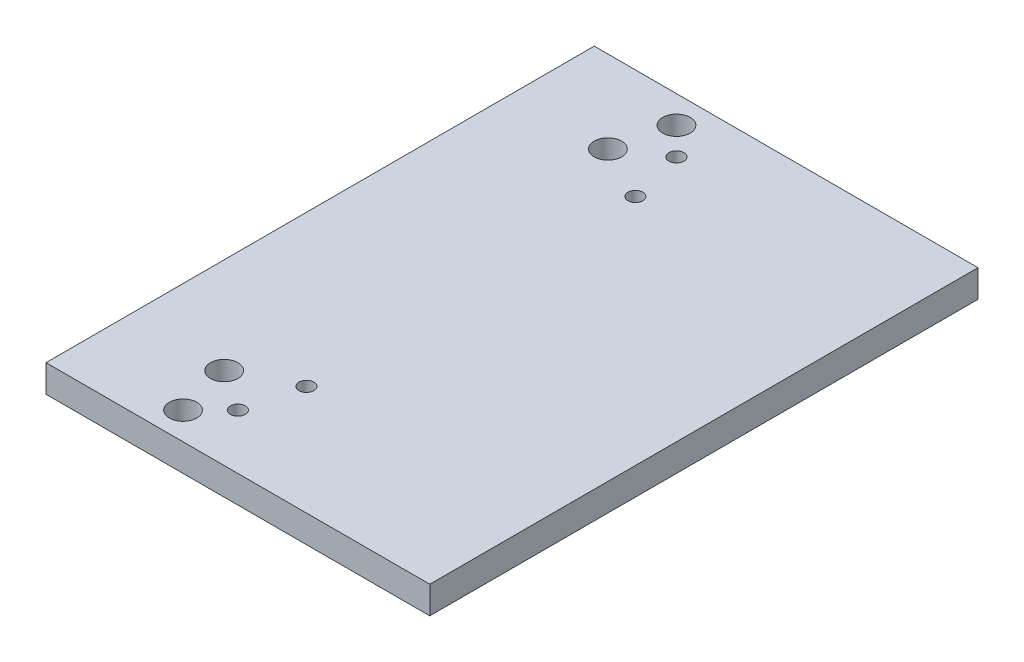
ISO-10303-21;
HEADER;
FILE_DESCRIPTION(('STEP AP214'),'2;1');
FILE_NAME('part.step','',(''),(''),'','','');
FILE_SCHEMA(('AUTOMOTIVE_DESIGN { 1 0 10303 214 1 1 1 1 }'));
ENDSEC;
DATA;
#1=APPLICATION_CONTEXT('core data for automotive mechanical design processes');
#2=APPLICATION_PROTOCOL_DEFINITION('international standard','automotive_design',2000,#1);
#3=PRODUCT_CONTEXT('',#1,'mechanical');
#4=PRODUCT('Part','Part','',(#3));
#5=PRODUCT_RELATED_PRODUCT_CATEGORY('part','',(#4));
#6=PRODUCT_DEFINITION_FORMATION('','',#4);
#7=PRODUCT_DEFINITION_CONTEXT('part definition',#1,'design');
#8=PRODUCT_DEFINITION('design','',#6,#7);
#9=PRODUCT_DEFINITION_SHAPE('','',#8);
#10=(LENGTH_UNIT() NAMED_UNIT(*) SI_UNIT(.MILLI.,.METRE.));
#11=(NAMED_UNIT(*) PLANE_ANGLE_UNIT() SI_UNIT($,.RADIAN.));
#12=(NAMED_UNIT(*) SI_UNIT($,.STERADIAN.) SOLID_ANGLE_UNIT());
#13=UNCERTAINTY_MEASURE_WITH_UNIT(LENGTH_MEASURE(1.E-05),#10,'distance_accuracy_value','');
#14=(GEOMETRIC_REPRESENTATION_CONTEXT(3) GLOBAL_UNCERTAINTY_ASSIGNED_CONTEXT((#13)) GLOBAL_UNIT_ASSIGNED_CONTEXT((#10,
#11,#12)) REPRESENTATION_CONTEXT('',''));
#15=CARTESIAN_POINT('',(0.,0.,0.));
#16=DIRECTION('',(0.,0.,1.));
#17=DIRECTION('',(1.,0.,0.));
#18=AXIS2_PLACEMENT_3D('',#15,#16,#17);
#19=CARTESIAN_POINT('',(0.,6.35,0.));
#20=DIRECTION('',(0.,-1.,0.));
#21=DIRECTION('',(0.,0.,-1.));
#22=AXIS2_PLACEMENT_3D('',#19,#20,#21);
#23=PLANE('',#22);
#24=CARTESIAN_POINT('',(-12.7,6.35,-50.8));
#25=DIRECTION('',(0.,1.,0.));
#26=DIRECTION('',(0.,0.,1.));
#27=AXIS2_PLACEMENT_3D('',#24,#25,#26);
#28=CIRCLE('',#27,1.7272);
#29=CARTESIAN_POINT('',(-12.7,6.35,-49.0728));
#30=VERTEX_POINT('',#29);
#31=EDGE_CURVE('E287',#30,#30,#28,.T.);
#32=ORIENTED_EDGE('',*,*,#31,.F.);
#33=EDGE_LOOP('',(#32));
#34=FACE_BOUND('',#33,.T.);
#35=CARTESIAN_POINT('',(-12.7,6.35,50.8));
#36=DIRECTION('',(0.,1.,0.));
#37=DIRECTION('',(0.,0.,1.));
#38=AXIS2_PLACEMENT_3D('',#35,#36,#37);
#39=CIRCLE('',#38,1.7272);
#40=CARTESIAN_POINT('',(-12.7,6.35,52.5272));
#41=VERTEX_POINT('',#40);
#42=EDGE_CURVE('E291',#41,#41,#39,.T.);
#43=ORIENTED_EDGE('',*,*,#42,.F.);
#44=EDGE_LOOP('',(#43));
#45=FACE_BOUND('',#44,.T.);
#46=CARTESIAN_POINT('',(-19.05,6.35,-57.15));
#47=DIRECTION('',(0.,1.,0.));
#48=DIRECTION('',(0.,0.,1.));
#49=AXIS2_PLACEMENT_3D('',#46,#47,#48);
#50=CIRCLE('',#49,3.175);
#51=CARTESIAN_POINT('',(-19.05,6.35,-53.975));
#52=VERTEX_POINT('',#51);
#53=EDGE_CURVE('E301',#52,#52,#50,.T.);
#54=ORIENTED_EDGE('',*,*,#53,.F.);
#55=EDGE_LOOP('',(#54));
#56=FACE_BOUND('',#55,.T.);
#57=CARTESIAN_POINT('',(-19.05,6.35,57.15));
#58=DIRECTION('',(0.,1.,0.));
#59=DIRECTION('',(0.,0.,1.));
#60=AXIS2_PLACEMENT_3D('',#57,#58,#59);
#61=CIRCLE('',#60,3.175);
#62=CARTESIAN_POINT('',(-19.05,6.35,60.325));
#63=VERTEX_POINT('',#62);
#64=EDGE_CURVE('E309',#63,#63,#61,.T.);
#65=ORIENTED_EDGE('',*,*,#64,.F.);
#66=EDGE_LOOP('',(#65));
#67=FACE_BOUND('',#66,.T.);
#68=CARTESIAN_POINT('',(-22.225,6.35,-44.45));
#69=DIRECTION('',(0.,1.,0.));
#70=DIRECTION('',(0.,0.,1.));
#71=AXIS2_PLACEMENT_3D('',#68,#69,#70);
#72=CIRCLE('',#71,3.175);
#73=CARTESIAN_POINT('',(-22.225,6.35,-41.275));
#74=VERTEX_POINT('',#73);
#75=EDGE_CURVE('E341',#74,#74,#72,.T.);
#76=ORIENTED_EDGE('',*,*,#75,.F.);
#77=EDGE_LOOP('',(#76));
#78=FACE_BOUND('',#77,.T.);
#79=DIRECTION('',(0.,0.,-1.));
#80=VECTOR('',#79,1.);
#81=CARTESIAN_POINT('',(-44.45,6.35,63.5));
#82=LINE('',#81,#80);
#83=CARTESIAN_POINT('',(-44.45,6.35,63.5));
#84=VERTEX_POINT('',#83);
#85=CARTESIAN_POINT('',(-44.45,6.35,-63.5));
#86=VERTEX_POINT('',#85);
#87=EDGE_CURVE('E107',#84,#86,#82,.T.);
#88=ORIENTED_EDGE('',*,*,#87,.F.);
#89=DIRECTION('',(1.,0.,0.));
#90=VECTOR('',#89,1.);
#91=CARTESIAN_POINT('',(-44.45,6.35,63.5));
#92=LINE('',#91,#90);
#93=CARTESIAN_POINT('',(44.45,6.35,63.5));
#94=VERTEX_POINT('',#93);
#95=EDGE_CURVE('E94',#84,#94,#92,.T.);
#96=ORIENTED_EDGE('',*,*,#95,.T.);
#97=DIRECTION('',(0.,0.,-1.));
#98=VECTOR('',#97,1.);
#99=CARTESIAN_POINT('',(44.45,6.35,63.5));
#100=LINE('',#99,#98);
#101=CARTESIAN_POINT('',(44.45,6.35,-63.5));
#102=VERTEX_POINT('',#101);
#103=EDGE_CURVE('E89',#94,#102,#100,.T.);
#104=ORIENTED_EDGE('',*,*,#103,.T.);
#105=DIRECTION('',(1.,0.,0.));
#106=VECTOR('',#105,1.);
#107=CARTESIAN_POINT('',(-44.45,6.35,-63.5));
#108=LINE('',#107,#106);
#109=EDGE_CURVE('E93',#86,#102,#108,.T.);
#110=ORIENTED_EDGE('',*,*,#109,.F.);
#111=EDGE_LOOP('',(#88,#96,#104,#110));
#112=FACE_BOUND('',#111,.T.);
#113=CARTESIAN_POINT('',(-22.225,6.35,44.45));
#114=DIRECTION('',(0.,1.,0.));
#115=DIRECTION('',(0.,0.,1.));
#116=AXIS2_PLACEMENT_3D('',#113,#114,#115);
#117=CIRCLE('',#116,3.175);
#118=CARTESIAN_POINT('',(-22.225,6.35,47.625));
#119=VERTEX_POINT('',#118);
#120=EDGE_CURVE('E333',#119,#119,#117,.T.);
#121=ORIENTED_EDGE('',*,*,#120,.F.);
#122=EDGE_LOOP('',(#121));
#123=FACE_BOUND('',#122,.T.);
#124=CARTESIAN_POINT('',(-9.525,6.35,-38.1));
#125=DIRECTION('',(0.,1.,0.));
#126=DIRECTION('',(0.,0.,1.));
#127=AXIS2_PLACEMENT_3D('',#124,#125,#126);
#128=CIRCLE('',#127,1.7272);
#129=CARTESIAN_POINT('',(-9.525,6.35,-36.3728));
#130=VERTEX_POINT('',#129);
#131=EDGE_CURVE('E325',#130,#130,#128,.T.);
#132=ORIENTED_EDGE('',*,*,#131,.F.);
#133=EDGE_LOOP('',(#132));
#134=FACE_BOUND('',#133,.T.);
#135=CARTESIAN_POINT('',(-9.52500000000001,6.35,38.1));
#136=DIRECTION('',(0.,1.,0.));
#137=DIRECTION('',(0.,0.,1.));
#138=AXIS2_PLACEMENT_3D('',#135,#136,#137);
#139=CIRCLE('',#138,1.7272);
#140=CARTESIAN_POINT('',(-9.52500000000001,6.35,39.8272));
#141=VERTEX_POINT('',#140);
#142=EDGE_CURVE('E317',#141,#141,#139,.T.);
#143=ORIENTED_EDGE('',*,*,#142,.F.);
#144=EDGE_LOOP('',(#143));
#145=FACE_BOUND('',#144,.T.);
#146=ADVANCED_FACE('F42',(#34,#45,#56,#67,#78,#112,#123,#134,#145),#23,.F.);
#147=CARTESIAN_POINT('',(-44.45,6.35,63.5));
#148=DIRECTION('',(-1.,0.,0.));
#149=DIRECTION('',(0.,0.,1.));
#150=AXIS2_PLACEMENT_3D('',#147,#148,#149);
#151=PLANE('',#150);
#152=DIRECTION('',(0.,0.,-1.));
#153=VECTOR('',#152,1.);
#154=CARTESIAN_POINT('',(-44.45,0.,63.5));
#155=LINE('',#154,#153);
#156=CARTESIAN_POINT('',(-44.45,0.,63.5));
#157=VERTEX_POINT('',#156);
#158=CARTESIAN_POINT('',(-44.45,0.,-63.5));
#159=VERTEX_POINT('',#158);
#160=EDGE_CURVE('E115',#157,#159,#155,.T.);
#161=ORIENTED_EDGE('',*,*,#160,.F.);
#162=DIRECTION('',(0.,-1.,0.));
#163=VECTOR('',#162,1.);
#164=CARTESIAN_POINT('',(-44.45,6.35,63.5));
#165=LINE('',#164,#163);
#166=EDGE_CURVE('E11',#84,#157,#165,.T.);
#167=ORIENTED_EDGE('',*,*,#166,.F.);
#168=ORIENTED_EDGE('',*,*,#87,.T.);
#169=DIRECTION('',(0.,-1.,0.));
#170=VECTOR('',#169,1.);
#171=CARTESIAN_POINT('',(-44.45,6.35,-63.5));
#172=LINE('',#171,#170);
#173=EDGE_CURVE('E46',#86,#159,#172,.T.);
#174=ORIENTED_EDGE('',*,*,#173,.T.);
#175=EDGE_LOOP('',(#161,#167,#168,#174));
#176=FACE_BOUND('',#175,.T.);
#177=ADVANCED_FACE('F44',(#176),#151,.T.);
#178=CARTESIAN_POINT('',(-44.45,6.35,63.5));
#179=DIRECTION('',(0.,0.,-1.));
#180=DIRECTION('',(-1.,0.,0.));
#181=AXIS2_PLACEMENT_3D('',#178,#179,#180);
#182=PLANE('',#181);
#183=DIRECTION('',(1.,0.,0.));
#184=VECTOR('',#183,1.);
#185=CARTESIAN_POINT('',(-44.45,0.,63.5));
#186=LINE('',#185,#184);
#187=CARTESIAN_POINT('',(44.45,0.,63.5));
#188=VERTEX_POINT('',#187);
#189=EDGE_CURVE('E77',#157,#188,#186,.T.);
#190=ORIENTED_EDGE('',*,*,#189,.T.);
#191=DIRECTION('',(0.,-1.,0.));
#192=VECTOR('',#191,1.);
#193=CARTESIAN_POINT('',(44.45,6.35,63.5));
#194=LINE('',#193,#192);
#195=EDGE_CURVE('E53',#94,#188,#194,.T.);
#196=ORIENTED_EDGE('',*,*,#195,.F.);
#197=ORIENTED_EDGE('',*,*,#95,.F.);
#198=ORIENTED_EDGE('',*,*,#166,.T.);
#199=EDGE_LOOP('',(#190,#196,#197,#198));
#200=FACE_BOUND('',#199,.T.);
#201=ADVANCED_FACE('F132',(#200),#182,.F.);
#202=CARTESIAN_POINT('',(44.45,6.35,63.5));
#203=DIRECTION('',(-1.,0.,0.));
#204=DIRECTION('',(0.,0.,1.));
#205=AXIS2_PLACEMENT_3D('',#202,#203,#204);
#206=PLANE('',#205);
#207=DIRECTION('',(0.,0.,-1.));
#208=VECTOR('',#207,1.);
#209=CARTESIAN_POINT('',(44.45,0.,63.5));
#210=LINE('',#209,#208);
#211=CARTESIAN_POINT('',(44.45,0.,-63.5));
#212=VERTEX_POINT('',#211);
#213=EDGE_CURVE('E102',#188,#212,#210,.T.);
#214=ORIENTED_EDGE('',*,*,#213,.T.);
#215=DIRECTION('',(0.,-1.,0.));
#216=VECTOR('',#215,1.);
#217=CARTESIAN_POINT('',(44.45,6.35,-63.5));
#218=LINE('',#217,#216);
#219=EDGE_CURVE('E99',#102,#212,#218,.T.);
#220=ORIENTED_EDGE('',*,*,#219,.F.);
#221=ORIENTED_EDGE('',*,*,#103,.F.);
#222=ORIENTED_EDGE('',*,*,#195,.T.);
#223=EDGE_LOOP('',(#214,#220,#221,#222));
#224=FACE_BOUND('',#223,.T.);
#225=ADVANCED_FACE('F100',(#224),#206,.F.);
#226=CARTESIAN_POINT('',(-44.45,6.35,-63.5));
#227=DIRECTION('',(0.,0.,-1.));
#228=DIRECTION('',(-1.,0.,0.));
#229=AXIS2_PLACEMENT_3D('',#226,#227,#228);
#230=PLANE('',#229);
#231=DIRECTION('',(1.,0.,0.));
#232=VECTOR('',#231,1.);
#233=CARTESIAN_POINT('',(-44.45,0.,-63.5));
#234=LINE('',#233,#232);
#235=EDGE_CURVE('E119',#159,#212,#234,.T.);
#236=ORIENTED_EDGE('',*,*,#235,.F.);
#237=ORIENTED_EDGE('',*,*,#173,.F.);
#238=ORIENTED_EDGE('',*,*,#109,.T.);
#239=ORIENTED_EDGE('',*,*,#219,.T.);
#240=EDGE_LOOP('',(#236,#237,#238,#239));
#241=FACE_BOUND('',#240,.T.);
#242=ADVANCED_FACE('F105',(#241),#230,.T.);
#243=CARTESIAN_POINT('',(0.,0.,0.));
#244=DIRECTION('',(0.,-1.,0.));
#245=DIRECTION('',(0.,0.,-1.));
#246=AXIS2_PLACEMENT_3D('',#243,#244,#245);
#247=PLANE('',#246);
#248=CARTESIAN_POINT('',(-12.7,0.,-50.8));
#249=DIRECTION('',(0.,1.,0.));
#250=DIRECTION('',(0.,0.,1.));
#251=AXIS2_PLACEMENT_3D('',#248,#249,#250);
#252=CIRCLE('',#251,1.7272);
#253=CARTESIAN_POINT('',(-12.7,0.,-49.0728));
#254=VERTEX_POINT('',#253);
#255=EDGE_CURVE('E285',#254,#254,#252,.T.);
#256=ORIENTED_EDGE('',*,*,#255,.T.);
#257=EDGE_LOOP('',(#256));
#258=FACE_BOUND('',#257,.T.);
#259=CARTESIAN_POINT('',(-12.7,0.,50.8));
#260=DIRECTION('',(0.,1.,0.));
#261=DIRECTION('',(0.,0.,1.));
#262=AXIS2_PLACEMENT_3D('',#259,#260,#261);
#263=CIRCLE('',#262,1.7272);
#264=CARTESIAN_POINT('',(-12.7,0.,52.5272));
#265=VERTEX_POINT('',#264);
#266=EDGE_CURVE('E297',#265,#265,#263,.T.);
#267=ORIENTED_EDGE('',*,*,#266,.T.);
#268=EDGE_LOOP('',(#267));
#269=FACE_BOUND('',#268,.T.);
#270=CARTESIAN_POINT('',(-19.05,0.,-57.15));
#271=DIRECTION('',(0.,1.,0.));
#272=DIRECTION('',(0.,0.,1.));
#273=AXIS2_PLACEMENT_3D('',#270,#271,#272);
#274=CIRCLE('',#273,3.175);
#275=CARTESIAN_POINT('',(-19.05,0.,-53.975));
#276=VERTEX_POINT('',#275);
#277=EDGE_CURVE('E305',#276,#276,#274,.T.);
#278=ORIENTED_EDGE('',*,*,#277,.T.);
#279=EDGE_LOOP('',(#278));
#280=FACE_BOUND('',#279,.T.);
#281=CARTESIAN_POINT('',(-19.05,0.,57.15));
#282=DIRECTION('',(0.,1.,0.));
#283=DIRECTION('',(0.,0.,1.));
#284=AXIS2_PLACEMENT_3D('',#281,#282,#283);
#285=CIRCLE('',#284,3.175);
#286=CARTESIAN_POINT('',(-19.05,0.,60.325));
#287=VERTEX_POINT('',#286);
#288=EDGE_CURVE('E313',#287,#287,#285,.T.);
#289=ORIENTED_EDGE('',*,*,#288,.T.);
#290=EDGE_LOOP('',(#289));
#291=FACE_BOUND('',#290,.T.);
#292=CARTESIAN_POINT('',(-9.52500000000001,0.,38.1));
#293=DIRECTION('',(0.,-1.,0.));
#294=DIRECTION('',(0.,0.,-1.));
#295=AXIS2_PLACEMENT_3D('',#292,#293,#294);
#296=CIRCLE('',#295,1.7272);
#297=CARTESIAN_POINT('',(-9.52500000000001,0.,36.3728));
#298=VERTEX_POINT('',#297);
#299=EDGE_CURVE('E321',#298,#298,#296,.T.);
#300=ORIENTED_EDGE('',*,*,#299,.F.);
#301=EDGE_LOOP('',(#300));
#302=FACE_BOUND('',#301,.T.);
#303=CARTESIAN_POINT('',(-9.525,0.,-38.1));
#304=DIRECTION('',(0.,-1.,0.));
#305=DIRECTION('',(0.,0.,-1.));
#306=AXIS2_PLACEMENT_3D('',#303,#304,#305);
#307=CIRCLE('',#306,1.7272);
#308=CARTESIAN_POINT('',(-9.525,0.,-39.8272));
#309=VERTEX_POINT('',#308);
#310=EDGE_CURVE('E329',#309,#309,#307,.T.);
#311=ORIENTED_EDGE('',*,*,#310,.F.);
#312=EDGE_LOOP('',(#311));
#313=FACE_BOUND('',#312,.T.);
#314=CARTESIAN_POINT('',(-22.225,0.,44.45));
#315=DIRECTION('',(0.,-1.,0.));
#316=DIRECTION('',(0.,0.,-1.));
#317=AXIS2_PLACEMENT_3D('',#314,#315,#316);
#318=CIRCLE('',#317,3.175);
#319=CARTESIAN_POINT('',(-22.225,0.,41.275));
#320=VERTEX_POINT('',#319);
#321=EDGE_CURVE('E337',#320,#320,#318,.T.);
#322=ORIENTED_EDGE('',*,*,#321,.F.);
#323=EDGE_LOOP('',(#322));
#324=FACE_BOUND('',#323,.T.);
#325=CARTESIAN_POINT('',(-22.225,0.,-44.45));
#326=DIRECTION('',(0.,-1.,0.));
#327=DIRECTION('',(0.,0.,-1.));
#328=AXIS2_PLACEMENT_3D('',#325,#326,#327);
#329=CIRCLE('',#328,3.175);
#330=CARTESIAN_POINT('',(-22.225,0.,-47.625));
#331=VERTEX_POINT('',#330);
#332=EDGE_CURVE('E120',#331,#331,#329,.T.);
#333=ORIENTED_EDGE('',*,*,#332,.F.);
#334=EDGE_LOOP('',(#333));
#335=FACE_BOUND('',#334,.T.);
#336=ORIENTED_EDGE('',*,*,#160,.T.);
#337=ORIENTED_EDGE('',*,*,#235,.T.);
#338=ORIENTED_EDGE('',*,*,#213,.F.);
#339=ORIENTED_EDGE('',*,*,#189,.F.);
#340=EDGE_LOOP('',(#336,#337,#338,#339));
#341=FACE_BOUND('',#340,.T.);
#342=ADVANCED_FACE('F129',(#258,#269,#280,#291,#302,#313,#324,#335,#341),#247,.T.);
#343=CARTESIAN_POINT('',(-22.225,6.35,-44.45));
#344=DIRECTION('',(0.,1.,0.));
#345=DIRECTION('',(0.,0.,1.));
#346=AXIS2_PLACEMENT_3D('',#343,#344,#345);
#347=CYLINDRICAL_SURFACE('',#346,3.175);
#348=ORIENTED_EDGE('',*,*,#75,.T.);
#349=EDGE_LOOP('',(#348));
#350=FACE_BOUND('',#349,.T.);
#351=ORIENTED_EDGE('',*,*,#332,.T.);
#352=EDGE_LOOP('',(#351));
#353=FACE_BOUND('',#352,.T.);
#354=ADVANCED_FACE('F147',(#350,#353),#347,.F.);
#355=CARTESIAN_POINT('',(-22.225,6.35,44.45));
#356=DIRECTION('',(0.,1.,0.));
#357=DIRECTION('',(0.,0.,1.));
#358=AXIS2_PLACEMENT_3D('',#355,#356,#357);
#359=CYLINDRICAL_SURFACE('',#358,3.175);
#360=ORIENTED_EDGE('',*,*,#120,.T.);
#361=EDGE_LOOP('',(#360));
#362=FACE_BOUND('',#361,.T.);
#363=ORIENTED_EDGE('',*,*,#321,.T.);
#364=EDGE_LOOP('',(#363));
#365=FACE_BOUND('',#364,.T.);
#366=ADVANCED_FACE('F182',(#362,#365),#359,.F.);
#367=CARTESIAN_POINT('',(-9.525,6.35,-38.1));
#368=DIRECTION('',(0.,1.,0.));
#369=DIRECTION('',(0.,0.,1.));
#370=AXIS2_PLACEMENT_3D('',#367,#368,#369);
#371=CYLINDRICAL_SURFACE('',#370,1.7272);
#372=ORIENTED_EDGE('',*,*,#131,.T.);
#373=EDGE_LOOP('',(#372));
#374=FACE_BOUND('',#373,.T.);
#375=ORIENTED_EDGE('',*,*,#310,.T.);
#376=EDGE_LOOP('',(#375));
#377=FACE_BOUND('',#376,.T.);
#378=ADVANCED_FACE('F189',(#374,#377),#371,.F.);
#379=CARTESIAN_POINT('',(-9.52500000000001,6.35,38.1));
#380=DIRECTION('',(0.,1.,0.));
#381=DIRECTION('',(0.,0.,1.));
#382=AXIS2_PLACEMENT_3D('',#379,#380,#381);
#383=CYLINDRICAL_SURFACE('',#382,1.7272);
#384=ORIENTED_EDGE('',*,*,#142,.T.);
#385=EDGE_LOOP('',(#384));
#386=FACE_BOUND('',#385,.T.);
#387=ORIENTED_EDGE('',*,*,#299,.T.);
#388=EDGE_LOOP('',(#387));
#389=FACE_BOUND('',#388,.T.);
#390=ADVANCED_FACE('F196',(#386,#389),#383,.F.);
#391=CARTESIAN_POINT('',(-19.05,6.35,57.15));
#392=DIRECTION('',(0.,1.,0.));
#393=DIRECTION('',(0.,0.,1.));
#394=AXIS2_PLACEMENT_3D('',#391,#392,#393);
#395=CYLINDRICAL_SURFACE('',#394,3.175);
#396=ORIENTED_EDGE('',*,*,#288,.F.);
#397=EDGE_LOOP('',(#396));
#398=FACE_BOUND('',#397,.T.);
#399=ORIENTED_EDGE('',*,*,#64,.T.);
#400=EDGE_LOOP('',(#399));
#401=FACE_BOUND('',#400,.T.);
#402=ADVANCED_FACE('F205',(#398,#401),#395,.F.);
#403=CARTESIAN_POINT('',(-19.05,6.35,-57.15));
#404=DIRECTION('',(0.,1.,0.));
#405=DIRECTION('',(0.,0.,1.));
#406=AXIS2_PLACEMENT_3D('',#403,#404,#405);
#407=CYLINDRICAL_SURFACE('',#406,3.175);
#408=ORIENTED_EDGE('',*,*,#277,.F.);
#409=EDGE_LOOP('',(#408));
#410=FACE_BOUND('',#409,.T.);
#411=ORIENTED_EDGE('',*,*,#53,.T.);
#412=EDGE_LOOP('',(#411));
#413=FACE_BOUND('',#412,.T.);
#414=ADVANCED_FACE('F214',(#410,#413),#407,.F.);
#415=CARTESIAN_POINT('',(-12.7,6.35,50.8));
#416=DIRECTION('',(0.,1.,0.));
#417=DIRECTION('',(0.,0.,1.));
#418=AXIS2_PLACEMENT_3D('',#415,#416,#417);
#419=CYLINDRICAL_SURFACE('',#418,1.7272);
#420=ORIENTED_EDGE('',*,*,#266,.F.);
#421=EDGE_LOOP('',(#420));
#422=FACE_BOUND('',#421,.T.);
#423=ORIENTED_EDGE('',*,*,#42,.T.);
#424=EDGE_LOOP('',(#423));
#425=FACE_BOUND('',#424,.T.);
#426=ADVANCED_FACE('F223',(#422,#425),#419,.F.);
#427=CARTESIAN_POINT('',(-12.7,6.35,-50.8));
#428=DIRECTION('',(0.,1.,0.));
#429=DIRECTION('',(0.,0.,1.));
#430=AXIS2_PLACEMENT_3D('',#427,#428,#429);
#431=CYLINDRICAL_SURFACE('',#430,1.7272);
#432=ORIENTED_EDGE('',*,*,#255,.F.);
#433=EDGE_LOOP('',(#432));
#434=FACE_BOUND('',#433,.T.);
#435=ORIENTED_EDGE('',*,*,#31,.T.);
#436=EDGE_LOOP('',(#435));
#437=FACE_BOUND('',#436,.T.);
#438=ADVANCED_FACE('F231',(#434,#437),#431,.F.);
#439=CLOSED_SHELL('',(#146,#177,#201,#225,#242,#342,#354,#366,#378,#390,#402,#414,#426,#438));
#440=MANIFOLD_SOLID_BREP('B2',#439);
#441=ADVANCED_BREP_SHAPE_REPRESENTATION('',(#18,#440),#14);
#442=SHAPE_DEFINITION_REPRESENTATION(#9,#441);
ENDSEC;
END-ISO-10303-21;
